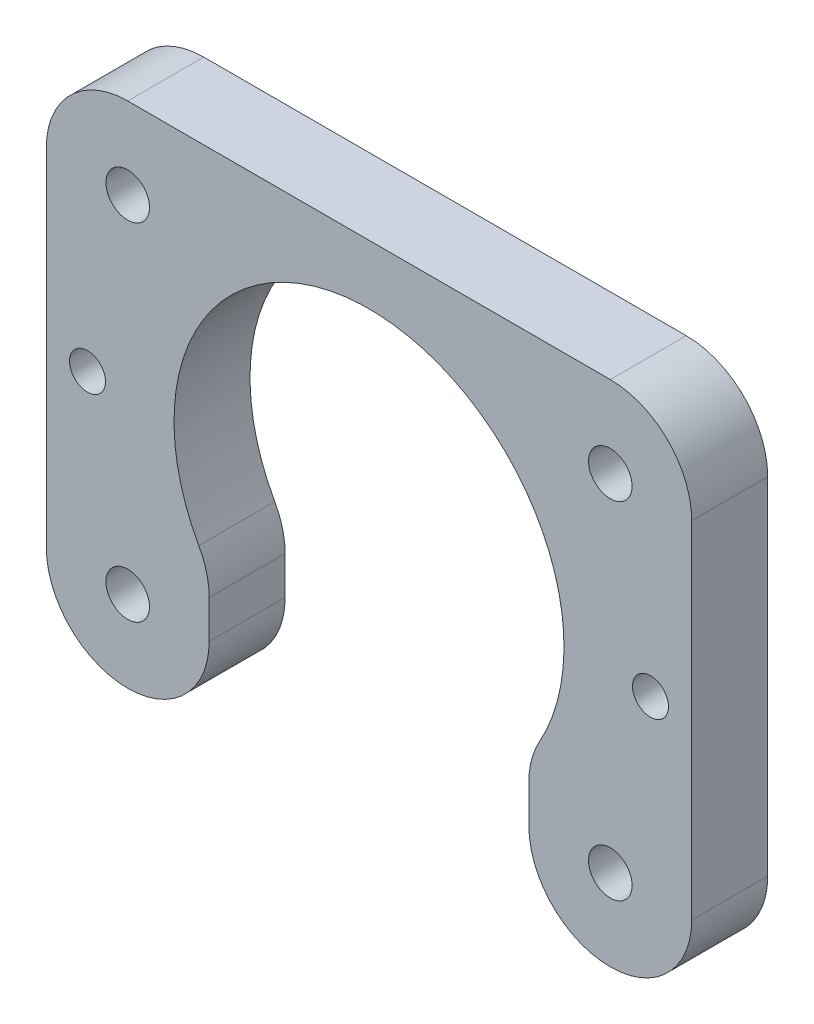
ISO-10303-21;
HEADER;
FILE_DESCRIPTION(('STEP AP214'),'2;1');
FILE_NAME('part.step','',(''),(''),'','','');
FILE_SCHEMA(('AUTOMOTIVE_DESIGN { 1 0 10303 214 1 1 1 1 }'));
ENDSEC;
DATA;
#1=APPLICATION_CONTEXT('core data for automotive mechanical design processes');
#2=APPLICATION_PROTOCOL_DEFINITION('international standard','automotive_design',2000,#1);
#3=PRODUCT_CONTEXT('',#1,'mechanical');
#4=PRODUCT('Part','Part','',(#3));
#5=PRODUCT_RELATED_PRODUCT_CATEGORY('part','',(#4));
#6=PRODUCT_DEFINITION_FORMATION('','',#4);
#7=PRODUCT_DEFINITION_CONTEXT('part definition',#1,'design');
#8=PRODUCT_DEFINITION('design','',#6,#7);
#9=PRODUCT_DEFINITION_SHAPE('','',#8);
#10=(LENGTH_UNIT() NAMED_UNIT(*) SI_UNIT(.MILLI.,.METRE.));
#11=(NAMED_UNIT(*) PLANE_ANGLE_UNIT() SI_UNIT($,.RADIAN.));
#12=(NAMED_UNIT(*) SI_UNIT($,.STERADIAN.) SOLID_ANGLE_UNIT());
#13=UNCERTAINTY_MEASURE_WITH_UNIT(LENGTH_MEASURE(1.E-05),#10,'distance_accuracy_value','');
#14=(GEOMETRIC_REPRESENTATION_CONTEXT(3) GLOBAL_UNCERTAINTY_ASSIGNED_CONTEXT((#13)) GLOBAL_UNIT_ASSIGNED_CONTEXT((#10,
#11,#12)) REPRESENTATION_CONTEXT('',''));
#15=CARTESIAN_POINT('',(0.,0.,0.));
#16=DIRECTION('',(0.,0.,1.));
#17=DIRECTION('',(1.,0.,0.));
#18=AXIS2_PLACEMENT_3D('',#15,#16,#17);
#19=CARTESIAN_POINT('',(-0.0799999999999945,20.,6.));
#20=DIRECTION('',(1.,0.,0.));
#21=DIRECTION('',(0.,0.,-1.));
#22=AXIS2_PLACEMENT_3D('',#19,#20,#21);
#23=PLANE('',#22);
#24=DIRECTION('',(0.,-1.,0.));
#25=VECTOR('',#24,1.);
#26=CARTESIAN_POINT('',(-0.0799999999999945,20.,0.));
#27=LINE('',#26,#25);
#28=CARTESIAN_POINT('',(-0.079999999999995,13.65,0.));
#29=VERTEX_POINT('',#28);
#30=CARTESIAN_POINT('',(-0.0799999999999945,-13.65,0.));
#31=VERTEX_POINT('',#30);
#32=EDGE_CURVE('E140',#29,#31,#27,.T.);
#33=ORIENTED_EDGE('',*,*,#32,.T.);
#34=DIRECTION('',(0.,0.,-1.));
#35=VECTOR('',#34,1.);
#36=CARTESIAN_POINT('',(-0.0799999999999945,-13.65,6.));
#37=LINE('',#36,#35);
#38=CARTESIAN_POINT('',(-0.0799999999999945,-13.65,6.));
#39=VERTEX_POINT('',#38);
#40=EDGE_CURVE('E134',#31,#39,#37,.F.);
#41=ORIENTED_EDGE('',*,*,#40,.T.);
#42=DIRECTION('',(0.,-1.,0.));
#43=VECTOR('',#42,1.);
#44=CARTESIAN_POINT('',(-0.0799999999999945,20.,6.));
#45=LINE('',#44,#43);
#46=CARTESIAN_POINT('',(-0.0799999999999945,13.65,6.));
#47=VERTEX_POINT('',#46);
#48=EDGE_CURVE('E136',#47,#39,#45,.T.);
#49=ORIENTED_EDGE('',*,*,#48,.F.);
#50=DIRECTION('',(0.,0.,-1.));
#51=VECTOR('',#50,1.);
#52=CARTESIAN_POINT('',(-0.0799999999999945,13.65,6.));
#53=LINE('',#52,#51);
#54=EDGE_CURVE('E145',#47,#29,#53,.T.);
#55=ORIENTED_EDGE('',*,*,#54,.T.);
#56=EDGE_LOOP('',(#33,#41,#49,#55));
#57=FACE_BOUND('',#56,.T.);
#58=ADVANCED_FACE('F35',(#57),#23,.F.);
#59=CARTESIAN_POINT('',(50.88,20.,6.));
#60=DIRECTION('',(-1.,0.,0.));
#61=DIRECTION('',(0.,0.,1.));
#62=AXIS2_PLACEMENT_3D('',#59,#60,#61);
#63=PLANE('',#62);
#64=DIRECTION('',(0.,1.,0.));
#65=VECTOR('',#64,1.);
#66=CARTESIAN_POINT('',(50.88,20.,6.));
#67=LINE('',#66,#65);
#68=CARTESIAN_POINT('',(50.88,-13.65,6.));
#69=VERTEX_POINT('',#68);
#70=CARTESIAN_POINT('',(50.88,13.65,6.));
#71=VERTEX_POINT('',#70);
#72=EDGE_CURVE('E152',#69,#71,#67,.T.);
#73=ORIENTED_EDGE('',*,*,#72,.F.);
#74=DIRECTION('',(0.,0.,1.));
#75=VECTOR('',#74,1.);
#76=CARTESIAN_POINT('',(50.88,-13.65,6.));
#77=LINE('',#76,#75);
#78=CARTESIAN_POINT('',(50.88,-13.65,0.));
#79=VERTEX_POINT('',#78);
#80=EDGE_CURVE('E284',#69,#79,#77,.F.);
#81=ORIENTED_EDGE('',*,*,#80,.T.);
#82=DIRECTION('',(0.,1.,0.));
#83=VECTOR('',#82,1.);
#84=CARTESIAN_POINT('',(50.88,20.,0.));
#85=LINE('',#84,#83);
#86=CARTESIAN_POINT('',(50.88,13.65,0.));
#87=VERTEX_POINT('',#86);
#88=EDGE_CURVE('E258',#79,#87,#85,.T.);
#89=ORIENTED_EDGE('',*,*,#88,.T.);
#90=DIRECTION('',(0.,0.,1.));
#91=VECTOR('',#90,1.);
#92=CARTESIAN_POINT('',(50.88,13.65,6.));
#93=LINE('',#92,#91);
#94=EDGE_CURVE('E144',#87,#71,#93,.T.);
#95=ORIENTED_EDGE('',*,*,#94,.T.);
#96=EDGE_LOOP('',(#73,#81,#89,#95));
#97=FACE_BOUND('',#96,.T.);
#98=ADVANCED_FACE('F321',(#97),#63,.F.);
#99=CARTESIAN_POINT('',(50.8,20.08,6.));
#100=DIRECTION('',(0.,-1.,0.));
#101=DIRECTION('',(0.,0.,-1.));
#102=AXIS2_PLACEMENT_3D('',#99,#100,#101);
#103=PLANE('',#102);
#104=DIRECTION('',(-1.,0.,0.));
#105=VECTOR('',#104,1.);
#106=CARTESIAN_POINT('',(50.8,20.08,6.));
#107=LINE('',#106,#105);
#108=CARTESIAN_POINT('',(44.45,20.08,6.));
#109=VERTEX_POINT('',#108);
#110=CARTESIAN_POINT('',(6.35000000000001,20.08,6.));
#111=VERTEX_POINT('',#110);
#112=EDGE_CURVE('E189',#109,#111,#107,.T.);
#113=ORIENTED_EDGE('',*,*,#112,.F.);
#114=DIRECTION('',(0.,0.,-1.));
#115=VECTOR('',#114,1.);
#116=CARTESIAN_POINT('',(44.45,20.08,6.));
#117=LINE('',#116,#115);
#118=CARTESIAN_POINT('',(44.45,20.08,0.));
#119=VERTEX_POINT('',#118);
#120=EDGE_CURVE('E12',#109,#119,#117,.T.);
#121=ORIENTED_EDGE('',*,*,#120,.T.);
#122=DIRECTION('',(-1.,0.,0.));
#123=VECTOR('',#122,1.);
#124=CARTESIAN_POINT('',(50.8,20.08,0.));
#125=LINE('',#124,#123);
#126=CARTESIAN_POINT('',(6.35000000000001,20.08,0.));
#127=VERTEX_POINT('',#126);
#128=EDGE_CURVE('E153',#119,#127,#125,.T.);
#129=ORIENTED_EDGE('',*,*,#128,.T.);
#130=DIRECTION('',(0.,0.,-1.));
#131=VECTOR('',#130,1.);
#132=CARTESIAN_POINT('',(6.35000000000001,20.08,6.));
#133=LINE('',#132,#131);
#134=EDGE_CURVE('E44',#127,#111,#133,.F.);
#135=ORIENTED_EDGE('',*,*,#134,.T.);
#136=EDGE_LOOP('',(#113,#121,#129,#135));
#137=FACE_BOUND('',#136,.T.);
#138=ADVANCED_FACE('F289',(#137),#103,.F.);
#139=CARTESIAN_POINT('',(0.,-20.,6.));
#140=DIRECTION('',(0.,0.,1.));
#141=DIRECTION('',(1.,0.,0.));
#142=AXIS2_PLACEMENT_3D('',#139,#140,#141);
#143=PLANE('',#142);
#144=CARTESIAN_POINT('',(3.17500000000001,0.,6.));
#145=DIRECTION('',(0.,0.,1.));
#146=DIRECTION('',(1.,0.,0.));
#147=AXIS2_PLACEMENT_3D('',#144,#145,#146);
#148=CIRCLE('',#147,1.42);
#149=CARTESIAN_POINT('',(4.59500000000001,0.,6.));
#150=VERTEX_POINT('',#149);
#151=EDGE_CURVE('E199',#150,#150,#148,.T.);
#152=ORIENTED_EDGE('',*,*,#151,.F.);
#153=EDGE_LOOP('',(#152));
#154=FACE_BOUND('',#153,.T.);
#155=CARTESIAN_POINT('',(47.625,0.,6.));
#156=DIRECTION('',(0.,0.,1.));
#157=DIRECTION('',(1.,0.,0.));
#158=AXIS2_PLACEMENT_3D('',#155,#156,#157);
#159=CIRCLE('',#158,1.42);
#160=CARTESIAN_POINT('',(49.045,0.,6.));
#161=VERTEX_POINT('',#160);
#162=EDGE_CURVE('E198',#161,#161,#159,.T.);
#163=ORIENTED_EDGE('',*,*,#162,.F.);
#164=EDGE_LOOP('',(#163));
#165=FACE_BOUND('',#164,.T.);
#166=CARTESIAN_POINT('',(25.4,0.,6.));
#167=DIRECTION('',(0.,0.,1.));
#168=DIRECTION('',(1.,0.,0.));
#169=AXIS2_PLACEMENT_3D('',#166,#167,#168);
#170=CIRCLE('',#169,15.395);
#171=CARTESIAN_POINT('',(38.837560137457,-7.51252304836568,6.));
#172=VERTEX_POINT('',#171);
#173=CARTESIAN_POINT('',(11.962439862543,-7.51252304836568,6.));
#174=VERTEX_POINT('',#173);
#175=EDGE_CURVE('E174',#172,#174,#170,.T.);
#176=ORIENTED_EDGE('',*,*,#175,.F.);
#177=CARTESIAN_POINT('',(44.45,-10.6502640812329,6.));
#178=DIRECTION('',(0.,0.,1.));
#179=DIRECTION('',(1.,0.,0.));
#180=AXIS2_PLACEMENT_3D('',#177,#178,#179);
#181=CIRCLE('',#180,6.43);
#182=CARTESIAN_POINT('',(38.02,-10.6502640812329,6.));
#183=VERTEX_POINT('',#182);
#184=EDGE_CURVE('E176',#172,#183,#181,.T.);
#185=ORIENTED_EDGE('',*,*,#184,.T.);
#186=DIRECTION('',(0.,1.,0.));
#187=VECTOR('',#186,1.);
#188=CARTESIAN_POINT('',(38.02,-20.,6.));
#189=LINE('',#188,#187);
#190=CARTESIAN_POINT('',(38.02,-13.65,6.));
#191=VERTEX_POINT('',#190);
#192=EDGE_CURVE('E173',#191,#183,#189,.T.);
#193=ORIENTED_EDGE('',*,*,#192,.F.);
#194=CARTESIAN_POINT('',(44.45,-13.65,6.));
#195=DIRECTION('',(0.,0.,1.));
#196=DIRECTION('',(1.,0.,0.));
#197=AXIS2_PLACEMENT_3D('',#194,#195,#196);
#198=CIRCLE('',#197,6.43);
#199=CARTESIAN_POINT('',(44.45,-20.08,6.));
#200=VERTEX_POINT('',#199);
#201=EDGE_CURVE('E160',#191,#200,#198,.T.);
#202=ORIENTED_EDGE('',*,*,#201,.T.);
#203=CARTESIAN_POINT('',(44.45,-13.65,6.));
#204=DIRECTION('',(0.,0.,1.));
#205=DIRECTION('',(1.,0.,0.));
#206=AXIS2_PLACEMENT_3D('',#203,#204,#205);
#207=CIRCLE('',#206,6.43);
#208=EDGE_CURVE('E164',#200,#69,#207,.T.);
#209=ORIENTED_EDGE('',*,*,#208,.T.);
#210=ORIENTED_EDGE('',*,*,#72,.T.);
#211=CARTESIAN_POINT('',(44.45,13.65,6.));
#212=DIRECTION('',(0.,0.,1.));
#213=DIRECTION('',(1.,0.,0.));
#214=AXIS2_PLACEMENT_3D('',#211,#212,#213);
#215=CIRCLE('',#214,6.43);
#216=EDGE_CURVE('E186',#71,#109,#215,.T.);
#217=ORIENTED_EDGE('',*,*,#216,.T.);
#218=ORIENTED_EDGE('',*,*,#112,.T.);
#219=CARTESIAN_POINT('',(6.35,13.65,6.));
#220=DIRECTION('',(0.,0.,1.));
#221=DIRECTION('',(1.,0.,0.));
#222=AXIS2_PLACEMENT_3D('',#219,#220,#221);
#223=CIRCLE('',#222,6.43);
#224=EDGE_CURVE('E128',#111,#47,#223,.T.);
#225=ORIENTED_EDGE('',*,*,#224,.T.);
#226=ORIENTED_EDGE('',*,*,#48,.T.);
#227=CARTESIAN_POINT('',(6.35,-13.65,6.));
#228=DIRECTION('',(0.,0.,1.));
#229=DIRECTION('',(1.,0.,0.));
#230=AXIS2_PLACEMENT_3D('',#227,#228,#229);
#231=CIRCLE('',#230,6.43);
#232=CARTESIAN_POINT('',(6.35000000000001,-20.08,6.));
#233=VERTEX_POINT('',#232);
#234=EDGE_CURVE('E150',#39,#233,#231,.T.);
#235=ORIENTED_EDGE('',*,*,#234,.T.);
#236=CARTESIAN_POINT('',(6.35000000000001,-13.65,6.));
#237=DIRECTION('',(0.,0.,1.));
#238=DIRECTION('',(1.,0.,0.));
#239=AXIS2_PLACEMENT_3D('',#236,#237,#238);
#240=CIRCLE('',#239,6.43);
#241=CARTESIAN_POINT('',(12.78,-13.65,6.));
#242=VERTEX_POINT('',#241);
#243=EDGE_CURVE('E159',#233,#242,#240,.T.);
#244=ORIENTED_EDGE('',*,*,#243,.T.);
#245=DIRECTION('',(0.,-1.,0.));
#246=VECTOR('',#245,1.);
#247=CARTESIAN_POINT('',(12.78,-20.,6.));
#248=LINE('',#247,#246);
#249=CARTESIAN_POINT('',(12.78,-10.6502640812329,6.));
#250=VERTEX_POINT('',#249);
#251=EDGE_CURVE('E170',#250,#242,#248,.T.);
#252=ORIENTED_EDGE('',*,*,#251,.F.);
#253=CARTESIAN_POINT('',(6.35000000000001,-10.6502640812329,6.));
#254=DIRECTION('',(0.,0.,1.));
#255=DIRECTION('',(1.,0.,0.));
#256=AXIS2_PLACEMENT_3D('',#253,#254,#255);
#257=CIRCLE('',#256,6.43);
#258=EDGE_CURVE('E162',#250,#174,#257,.T.);
#259=ORIENTED_EDGE('',*,*,#258,.T.);
#260=EDGE_LOOP('',(#176,#185,#193,#202,#209,#210,#217,#218,#225,#226,#235,#244,#252,#259));
#261=FACE_BOUND('',#260,.T.);
#262=CARTESIAN_POINT('',(6.34999999999999,13.65,6.));
#263=DIRECTION('',(0.,0.,1.));
#264=DIRECTION('',(1.,0.,0.));
#265=AXIS2_PLACEMENT_3D('',#262,#263,#264);
#266=CIRCLE('',#265,1.72);
#267=CARTESIAN_POINT('',(8.06999999999999,13.65,6.));
#268=VERTEX_POINT('',#267);
#269=EDGE_CURVE('E38',#268,#268,#266,.T.);
#270=ORIENTED_EDGE('',*,*,#269,.F.);
#271=EDGE_LOOP('',(#270));
#272=FACE_BOUND('',#271,.T.);
#273=CARTESIAN_POINT('',(6.34999999999999,-13.65,6.));
#274=DIRECTION('',(0.,0.,1.));
#275=DIRECTION('',(1.,0.,0.));
#276=AXIS2_PLACEMENT_3D('',#273,#274,#275);
#277=CIRCLE('',#276,1.72);
#278=CARTESIAN_POINT('',(8.06999999999999,-13.65,6.));
#279=VERTEX_POINT('',#278);
#280=EDGE_CURVE('E211',#279,#279,#277,.T.);
#281=ORIENTED_EDGE('',*,*,#280,.F.);
#282=EDGE_LOOP('',(#281));
#283=FACE_BOUND('',#282,.T.);
#284=CARTESIAN_POINT('',(44.45,-13.65,6.));
#285=DIRECTION('',(0.,0.,1.));
#286=DIRECTION('',(1.,0.,0.));
#287=AXIS2_PLACEMENT_3D('',#284,#285,#286);
#288=CIRCLE('',#287,1.72);
#289=CARTESIAN_POINT('',(46.17,-13.65,6.));
#290=VERTEX_POINT('',#289);
#291=EDGE_CURVE('E210',#290,#290,#288,.T.);
#292=ORIENTED_EDGE('',*,*,#291,.F.);
#293=EDGE_LOOP('',(#292));
#294=FACE_BOUND('',#293,.T.);
#295=CARTESIAN_POINT('',(44.45,13.65,6.));
#296=DIRECTION('',(0.,0.,1.));
#297=DIRECTION('',(1.,0.,0.));
#298=AXIS2_PLACEMENT_3D('',#295,#296,#297);
#299=CIRCLE('',#298,1.72);
#300=CARTESIAN_POINT('',(46.17,13.65,6.));
#301=VERTEX_POINT('',#300);
#302=EDGE_CURVE('E218',#301,#301,#299,.T.);
#303=ORIENTED_EDGE('',*,*,#302,.F.);
#304=EDGE_LOOP('',(#303));
#305=FACE_BOUND('',#304,.T.);
#306=ADVANCED_FACE('F148',(#154,#165,#261,#272,#283,#294,#305),#143,.T.);
#307=CARTESIAN_POINT('',(0.,-20.,0.));
#308=DIRECTION('',(0.,0.,1.));
#309=DIRECTION('',(1.,0.,0.));
#310=AXIS2_PLACEMENT_3D('',#307,#308,#309);
#311=PLANE('',#310);
#312=CARTESIAN_POINT('',(3.17500000000001,0.,0.));
#313=DIRECTION('',(0.,0.,1.));
#314=DIRECTION('',(1.,0.,0.));
#315=AXIS2_PLACEMENT_3D('',#312,#313,#314);
#316=CIRCLE('',#315,1.42);
#317=CARTESIAN_POINT('',(4.59500000000001,0.,0.));
#318=VERTEX_POINT('',#317);
#319=EDGE_CURVE('E195',#318,#318,#316,.T.);
#320=ORIENTED_EDGE('',*,*,#319,.T.);
#321=EDGE_LOOP('',(#320));
#322=FACE_BOUND('',#321,.T.);
#323=CARTESIAN_POINT('',(47.625,0.,0.));
#324=DIRECTION('',(0.,0.,1.));
#325=DIRECTION('',(1.,0.,0.));
#326=AXIS2_PLACEMENT_3D('',#323,#324,#325);
#327=CIRCLE('',#326,1.42);
#328=CARTESIAN_POINT('',(49.045,0.,0.));
#329=VERTEX_POINT('',#328);
#330=EDGE_CURVE('E202',#329,#329,#327,.T.);
#331=ORIENTED_EDGE('',*,*,#330,.T.);
#332=EDGE_LOOP('',(#331));
#333=FACE_BOUND('',#332,.T.);
#334=CARTESIAN_POINT('',(6.34999999999999,13.65,0.));
#335=DIRECTION('',(0.,0.,1.));
#336=DIRECTION('',(1.,0.,0.));
#337=AXIS2_PLACEMENT_3D('',#334,#335,#336);
#338=CIRCLE('',#337,1.72);
#339=CARTESIAN_POINT('',(8.06999999999999,13.65,0.));
#340=VERTEX_POINT('',#339);
#341=EDGE_CURVE('E214',#340,#340,#338,.T.);
#342=ORIENTED_EDGE('',*,*,#341,.T.);
#343=EDGE_LOOP('',(#342));
#344=FACE_BOUND('',#343,.T.);
#345=CARTESIAN_POINT('',(6.34999999999999,-13.65,0.));
#346=DIRECTION('',(0.,0.,1.));
#347=DIRECTION('',(1.,0.,0.));
#348=AXIS2_PLACEMENT_3D('',#345,#346,#347);
#349=CIRCLE('',#348,1.72);
#350=CARTESIAN_POINT('',(8.06999999999999,-13.65,0.));
#351=VERTEX_POINT('',#350);
#352=EDGE_CURVE('E207',#351,#351,#349,.T.);
#353=ORIENTED_EDGE('',*,*,#352,.T.);
#354=EDGE_LOOP('',(#353));
#355=FACE_BOUND('',#354,.T.);
#356=CARTESIAN_POINT('',(44.45,-13.65,0.));
#357=DIRECTION('',(0.,0.,1.));
#358=DIRECTION('',(1.,0.,0.));
#359=AXIS2_PLACEMENT_3D('',#356,#357,#358);
#360=CIRCLE('',#359,1.72);
#361=CARTESIAN_POINT('',(46.17,-13.65,0.));
#362=VERTEX_POINT('',#361);
#363=EDGE_CURVE('E215',#362,#362,#360,.T.);
#364=ORIENTED_EDGE('',*,*,#363,.T.);
#365=EDGE_LOOP('',(#364));
#366=FACE_BOUND('',#365,.T.);
#367=CARTESIAN_POINT('',(44.45,13.65,0.));
#368=DIRECTION('',(0.,0.,1.));
#369=DIRECTION('',(1.,0.,0.));
#370=AXIS2_PLACEMENT_3D('',#367,#368,#369);
#371=CIRCLE('',#370,1.72);
#372=CARTESIAN_POINT('',(46.17,13.65,0.));
#373=VERTEX_POINT('',#372);
#374=EDGE_CURVE('E221',#373,#373,#371,.T.);
#375=ORIENTED_EDGE('',*,*,#374,.T.);
#376=EDGE_LOOP('',(#375));
#377=FACE_BOUND('',#376,.T.);
#378=DIRECTION('',(0.,1.,0.));
#379=VECTOR('',#378,1.);
#380=CARTESIAN_POINT('',(38.02,-20.,0.));
#381=LINE('',#380,#379);
#382=CARTESIAN_POINT('',(38.02,-13.65,0.));
#383=VERTEX_POINT('',#382);
#384=CARTESIAN_POINT('',(38.02,-10.6502640812329,0.));
#385=VERTEX_POINT('',#384);
#386=EDGE_CURVE('E229',#383,#385,#381,.T.);
#387=ORIENTED_EDGE('',*,*,#386,.T.);
#388=CARTESIAN_POINT('',(44.45,-10.6502640812329,0.));
#389=DIRECTION('',(0.,0.,1.));
#390=DIRECTION('',(1.,0.,0.));
#391=AXIS2_PLACEMENT_3D('',#388,#389,#390);
#392=CIRCLE('',#391,6.43);
#393=CARTESIAN_POINT('',(38.837560137457,-7.51252304836569,0.));
#394=VERTEX_POINT('',#393);
#395=EDGE_CURVE('E242',#385,#394,#392,.F.);
#396=ORIENTED_EDGE('',*,*,#395,.T.);
#397=CARTESIAN_POINT('',(25.4,0.,0.));
#398=DIRECTION('',(0.,0.,1.));
#399=DIRECTION('',(1.,0.,0.));
#400=AXIS2_PLACEMENT_3D('',#397,#398,#399);
#401=CIRCLE('',#400,15.395);
#402=CARTESIAN_POINT('',(11.962439862543,-7.51252304836568,0.));
#403=VERTEX_POINT('',#402);
#404=EDGE_CURVE('E183',#394,#403,#401,.T.);
#405=ORIENTED_EDGE('',*,*,#404,.T.);
#406=CARTESIAN_POINT('',(6.35000000000001,-10.6502640812329,0.));
#407=DIRECTION('',(0.,0.,1.));
#408=DIRECTION('',(1.,0.,0.));
#409=AXIS2_PLACEMENT_3D('',#406,#407,#408);
#410=CIRCLE('',#409,6.43);
#411=CARTESIAN_POINT('',(12.78,-10.6502640812329,0.));
#412=VERTEX_POINT('',#411);
#413=EDGE_CURVE('E245',#403,#412,#410,.F.);
#414=ORIENTED_EDGE('',*,*,#413,.T.);
#415=DIRECTION('',(0.,-1.,0.));
#416=VECTOR('',#415,1.);
#417=CARTESIAN_POINT('',(12.78,-20.,0.));
#418=LINE('',#417,#416);
#419=CARTESIAN_POINT('',(12.78,-13.65,0.));
#420=VERTEX_POINT('',#419);
#421=EDGE_CURVE('E233',#412,#420,#418,.T.);
#422=ORIENTED_EDGE('',*,*,#421,.T.);
#423=CARTESIAN_POINT('',(6.35000000000001,-13.65,0.));
#424=DIRECTION('',(0.,0.,1.));
#425=DIRECTION('',(1.,0.,0.));
#426=AXIS2_PLACEMENT_3D('',#423,#424,#425);
#427=CIRCLE('',#426,6.43);
#428=CARTESIAN_POINT('',(6.35000000000001,-20.08,0.));
#429=VERTEX_POINT('',#428);
#430=EDGE_CURVE('E167',#420,#429,#427,.F.);
#431=ORIENTED_EDGE('',*,*,#430,.T.);
#432=CARTESIAN_POINT('',(6.35,-13.65,0.));
#433=DIRECTION('',(0.,0.,1.));
#434=DIRECTION('',(1.,0.,0.));
#435=AXIS2_PLACEMENT_3D('',#432,#433,#434);
#436=CIRCLE('',#435,6.43);
#437=EDGE_CURVE('E250',#429,#31,#436,.F.);
#438=ORIENTED_EDGE('',*,*,#437,.T.);
#439=ORIENTED_EDGE('',*,*,#32,.F.);
#440=CARTESIAN_POINT('',(6.35,13.65,0.));
#441=DIRECTION('',(0.,0.,1.));
#442=DIRECTION('',(1.,0.,0.));
#443=AXIS2_PLACEMENT_3D('',#440,#441,#442);
#444=CIRCLE('',#443,6.43);
#445=EDGE_CURVE('E181',#29,#127,#444,.F.);
#446=ORIENTED_EDGE('',*,*,#445,.T.);
#447=ORIENTED_EDGE('',*,*,#128,.F.);
#448=CARTESIAN_POINT('',(44.45,13.65,0.));
#449=DIRECTION('',(0.,0.,1.));
#450=DIRECTION('',(1.,0.,0.));
#451=AXIS2_PLACEMENT_3D('',#448,#449,#450);
#452=CIRCLE('',#451,6.43);
#453=EDGE_CURVE('E53',#119,#87,#452,.F.);
#454=ORIENTED_EDGE('',*,*,#453,.T.);
#455=ORIENTED_EDGE('',*,*,#88,.F.);
#456=CARTESIAN_POINT('',(44.45,-13.65,0.));
#457=DIRECTION('',(0.,0.,1.));
#458=DIRECTION('',(1.,0.,0.));
#459=AXIS2_PLACEMENT_3D('',#456,#457,#458);
#460=CIRCLE('',#459,6.43);
#461=CARTESIAN_POINT('',(44.45,-20.08,0.));
#462=VERTEX_POINT('',#461);
#463=EDGE_CURVE('E253',#79,#462,#460,.F.);
#464=ORIENTED_EDGE('',*,*,#463,.T.);
#465=CARTESIAN_POINT('',(44.45,-13.65,0.));
#466=DIRECTION('',(0.,0.,1.));
#467=DIRECTION('',(1.,0.,0.));
#468=AXIS2_PLACEMENT_3D('',#465,#466,#467);
#469=CIRCLE('',#468,6.43);
#470=EDGE_CURVE('E240',#462,#383,#469,.F.);
#471=ORIENTED_EDGE('',*,*,#470,.T.);
#472=EDGE_LOOP('',(#387,#396,#405,#414,#422,#431,#438,#439,#446,#447,#454,#455,#464,#471));
#473=FACE_BOUND('',#472,.T.);
#474=ADVANCED_FACE('F266',(#322,#333,#344,#355,#366,#377,#473),#311,.F.);
#475=CARTESIAN_POINT('',(44.45,13.65,0.));
#476=DIRECTION('',(0.,0.,1.));
#477=DIRECTION('',(1.,0.,0.));
#478=AXIS2_PLACEMENT_3D('',#475,#476,#477);
#479=CYLINDRICAL_SURFACE('',#478,1.72);
#480=ORIENTED_EDGE('',*,*,#374,.F.);
#481=EDGE_LOOP('',(#480));
#482=FACE_BOUND('',#481,.T.);
#483=ORIENTED_EDGE('',*,*,#302,.T.);
#484=EDGE_LOOP('',(#483));
#485=FACE_BOUND('',#484,.T.);
#486=ADVANCED_FACE('F367',(#482,#485),#479,.F.);
#487=CARTESIAN_POINT('',(44.45,-13.65,0.));
#488=DIRECTION('',(0.,0.,1.));
#489=DIRECTION('',(1.,0.,0.));
#490=AXIS2_PLACEMENT_3D('',#487,#488,#489);
#491=CYLINDRICAL_SURFACE('',#490,1.72);
#492=ORIENTED_EDGE('',*,*,#363,.F.);
#493=EDGE_LOOP('',(#492));
#494=FACE_BOUND('',#493,.T.);
#495=ORIENTED_EDGE('',*,*,#291,.T.);
#496=EDGE_LOOP('',(#495));
#497=FACE_BOUND('',#496,.T.);
#498=ADVANCED_FACE('F391',(#494,#497),#491,.F.);
#499=CARTESIAN_POINT('',(6.34999999999999,-13.65,0.));
#500=DIRECTION('',(0.,0.,1.));
#501=DIRECTION('',(1.,0.,0.));
#502=AXIS2_PLACEMENT_3D('',#499,#500,#501);
#503=CYLINDRICAL_SURFACE('',#502,1.72);
#504=ORIENTED_EDGE('',*,*,#352,.F.);
#505=EDGE_LOOP('',(#504));
#506=FACE_BOUND('',#505,.T.);
#507=ORIENTED_EDGE('',*,*,#280,.T.);
#508=EDGE_LOOP('',(#507));
#509=FACE_BOUND('',#508,.T.);
#510=ADVANCED_FACE('F388',(#506,#509),#503,.F.);
#511=CARTESIAN_POINT('',(6.34999999999999,13.65,0.));
#512=DIRECTION('',(0.,0.,1.));
#513=DIRECTION('',(1.,0.,0.));
#514=AXIS2_PLACEMENT_3D('',#511,#512,#513);
#515=CYLINDRICAL_SURFACE('',#514,1.72);
#516=ORIENTED_EDGE('',*,*,#341,.F.);
#517=EDGE_LOOP('',(#516));
#518=FACE_BOUND('',#517,.T.);
#519=ORIENTED_EDGE('',*,*,#269,.T.);
#520=EDGE_LOOP('',(#519));
#521=FACE_BOUND('',#520,.T.);
#522=ADVANCED_FACE('F356',(#518,#521),#515,.F.);
#523=CARTESIAN_POINT('',(25.4,0.,0.));
#524=DIRECTION('',(0.,0.,1.));
#525=DIRECTION('',(1.,0.,0.));
#526=AXIS2_PLACEMENT_3D('',#523,#524,#525);
#527=CYLINDRICAL_SURFACE('',#526,15.395);
#528=ORIENTED_EDGE('',*,*,#404,.F.);
#529=DIRECTION('',(0.,0.,1.));
#530=VECTOR('',#529,1.);
#531=CARTESIAN_POINT('',(38.837560137457,-7.51252304836569,0.));
#532=LINE('',#531,#530);
#533=EDGE_CURVE('E303',#394,#172,#532,.T.);
#534=ORIENTED_EDGE('',*,*,#533,.T.);
#535=ORIENTED_EDGE('',*,*,#175,.T.);
#536=DIRECTION('',(0.,0.,1.));
#537=VECTOR('',#536,1.);
#538=CARTESIAN_POINT('',(11.962439862543,-7.51252304836568,0.));
#539=LINE('',#538,#537);
#540=EDGE_CURVE('E244',#174,#403,#539,.F.);
#541=ORIENTED_EDGE('',*,*,#540,.T.);
#542=EDGE_LOOP('',(#528,#534,#535,#541));
#543=FACE_BOUND('',#542,.T.);
#544=ADVANCED_FACE('F311',(#543),#527,.F.);
#545=CARTESIAN_POINT('',(38.02,-20.,0.));
#546=DIRECTION('',(1.,0.,0.));
#547=DIRECTION('',(0.,1.,0.));
#548=AXIS2_PLACEMENT_3D('',#545,#546,#547);
#549=PLANE('',#548);
#550=ORIENTED_EDGE('',*,*,#386,.F.);
#551=DIRECTION('',(0.,0.,1.));
#552=VECTOR('',#551,1.);
#553=CARTESIAN_POINT('',(38.02,-13.65,0.));
#554=LINE('',#553,#552);
#555=EDGE_CURVE('E193',#383,#191,#554,.T.);
#556=ORIENTED_EDGE('',*,*,#555,.T.);
#557=ORIENTED_EDGE('',*,*,#192,.T.);
#558=DIRECTION('',(0.,0.,1.));
#559=VECTOR('',#558,1.);
#560=CARTESIAN_POINT('',(38.02,-10.6502640812329,0.));
#561=LINE('',#560,#559);
#562=EDGE_CURVE('E192',#183,#385,#561,.F.);
#563=ORIENTED_EDGE('',*,*,#562,.T.);
#564=EDGE_LOOP('',(#550,#556,#557,#563));
#565=FACE_BOUND('',#564,.T.);
#566=ADVANCED_FACE('F318',(#565),#549,.F.);
#567=CARTESIAN_POINT('',(12.78,-8.84226356766187,0.));
#568=DIRECTION('',(-1.,0.,0.));
#569=DIRECTION('',(0.,-1.,0.));
#570=AXIS2_PLACEMENT_3D('',#567,#568,#569);
#571=PLANE('',#570);
#572=ORIENTED_EDGE('',*,*,#421,.F.);
#573=DIRECTION('',(0.,0.,1.));
#574=VECTOR('',#573,1.);
#575=CARTESIAN_POINT('',(12.78,-10.6502640812329,0.));
#576=LINE('',#575,#574);
#577=EDGE_CURVE('E295',#412,#250,#576,.T.);
#578=ORIENTED_EDGE('',*,*,#577,.T.);
#579=ORIENTED_EDGE('',*,*,#251,.T.);
#580=DIRECTION('',(0.,0.,1.));
#581=VECTOR('',#580,1.);
#582=CARTESIAN_POINT('',(12.78,-13.65,0.));
#583=LINE('',#582,#581);
#584=EDGE_CURVE('E297',#242,#420,#583,.F.);
#585=ORIENTED_EDGE('',*,*,#584,.T.);
#586=EDGE_LOOP('',(#572,#578,#579,#585));
#587=FACE_BOUND('',#586,.T.);
#588=ADVANCED_FACE('F349',(#587),#571,.F.);
#589=CARTESIAN_POINT('',(44.45,-13.65,6.));
#590=DIRECTION('',(0.,0.,-1.));
#591=DIRECTION('',(-1.,0.,0.));
#592=AXIS2_PLACEMENT_3D('',#589,#590,#591);
#593=CYLINDRICAL_SURFACE('',#592,6.43);
#594=DIRECTION('',(0.,0.,1.));
#595=VECTOR('',#594,1.);
#596=CARTESIAN_POINT('',(44.45,-20.08,0.));
#597=LINE('',#596,#595);
#598=EDGE_CURVE('E179',#462,#200,#597,.T.);
#599=ORIENTED_EDGE('',*,*,#598,.F.);
#600=ORIENTED_EDGE('',*,*,#463,.F.);
#601=ORIENTED_EDGE('',*,*,#80,.F.);
#602=ORIENTED_EDGE('',*,*,#208,.F.);
#603=EDGE_LOOP('',(#599,#600,#601,#602));
#604=FACE_BOUND('',#603,.T.);
#605=ADVANCED_FACE('F272',(#604),#593,.T.);
#606=CARTESIAN_POINT('',(44.45,-13.65,0.));
#607=DIRECTION('',(0.,0.,1.));
#608=DIRECTION('',(1.,0.,0.));
#609=AXIS2_PLACEMENT_3D('',#606,#607,#608);
#610=CYLINDRICAL_SURFACE('',#609,6.43);
#611=ORIENTED_EDGE('',*,*,#470,.F.);
#612=ORIENTED_EDGE('',*,*,#598,.T.);
#613=ORIENTED_EDGE('',*,*,#201,.F.);
#614=ORIENTED_EDGE('',*,*,#555,.F.);
#615=EDGE_LOOP('',(#611,#612,#613,#614));
#616=FACE_BOUND('',#615,.T.);
#617=ADVANCED_FACE('F276',(#616),#610,.T.);
#618=CARTESIAN_POINT('',(44.45,-10.6502640812329,0.));
#619=DIRECTION('',(0.,0.,1.));
#620=DIRECTION('',(1.,0.,0.));
#621=AXIS2_PLACEMENT_3D('',#618,#619,#620);
#622=CYLINDRICAL_SURFACE('',#621,6.43);
#623=ORIENTED_EDGE('',*,*,#395,.F.);
#624=ORIENTED_EDGE('',*,*,#562,.F.);
#625=ORIENTED_EDGE('',*,*,#184,.F.);
#626=ORIENTED_EDGE('',*,*,#533,.F.);
#627=EDGE_LOOP('',(#623,#624,#625,#626));
#628=FACE_BOUND('',#627,.T.);
#629=ADVANCED_FACE('F317',(#628),#622,.T.);
#630=CARTESIAN_POINT('',(6.35000000000001,-10.6502640812329,0.));
#631=DIRECTION('',(0.,0.,1.));
#632=DIRECTION('',(1.,0.,0.));
#633=AXIS2_PLACEMENT_3D('',#630,#631,#632);
#634=CYLINDRICAL_SURFACE('',#633,6.43);
#635=ORIENTED_EDGE('',*,*,#413,.F.);
#636=ORIENTED_EDGE('',*,*,#540,.F.);
#637=ORIENTED_EDGE('',*,*,#258,.F.);
#638=ORIENTED_EDGE('',*,*,#577,.F.);
#639=EDGE_LOOP('',(#635,#636,#637,#638));
#640=FACE_BOUND('',#639,.T.);
#641=ADVANCED_FACE('F315',(#640),#634,.T.);
#642=CARTESIAN_POINT('',(6.35,-13.65,6.));
#643=DIRECTION('',(0.,0.,-1.));
#644=DIRECTION('',(-1.,0.,0.));
#645=AXIS2_PLACEMENT_3D('',#642,#643,#644);
#646=CYLINDRICAL_SURFACE('',#645,6.43);
#647=ORIENTED_EDGE('',*,*,#40,.F.);
#648=ORIENTED_EDGE('',*,*,#437,.F.);
#649=DIRECTION('',(0.,0.,1.));
#650=VECTOR('',#649,1.);
#651=CARTESIAN_POINT('',(6.35000000000001,-20.08,6.));
#652=LINE('',#651,#650);
#653=EDGE_CURVE('E157',#233,#429,#652,.F.);
#654=ORIENTED_EDGE('',*,*,#653,.F.);
#655=ORIENTED_EDGE('',*,*,#234,.F.);
#656=EDGE_LOOP('',(#647,#648,#654,#655));
#657=FACE_BOUND('',#656,.T.);
#658=ADVANCED_FACE('F155',(#657),#646,.T.);
#659=CARTESIAN_POINT('',(6.35000000000001,-13.65,6.));
#660=DIRECTION('',(0.,0.,1.));
#661=DIRECTION('',(1.,0.,0.));
#662=AXIS2_PLACEMENT_3D('',#659,#660,#661);
#663=CYLINDRICAL_SURFACE('',#662,6.43);
#664=ORIENTED_EDGE('',*,*,#430,.F.);
#665=ORIENTED_EDGE('',*,*,#584,.F.);
#666=ORIENTED_EDGE('',*,*,#243,.F.);
#667=ORIENTED_EDGE('',*,*,#653,.T.);
#668=EDGE_LOOP('',(#664,#665,#666,#667));
#669=FACE_BOUND('',#668,.T.);
#670=ADVANCED_FACE('F328',(#669),#663,.T.);
#671=CARTESIAN_POINT('',(44.45,13.65,6.));
#672=DIRECTION('',(0.,0.,-1.));
#673=DIRECTION('',(-1.,0.,0.));
#674=AXIS2_PLACEMENT_3D('',#671,#672,#673);
#675=CYLINDRICAL_SURFACE('',#674,6.43);
#676=ORIENTED_EDGE('',*,*,#216,.F.);
#677=ORIENTED_EDGE('',*,*,#94,.F.);
#678=ORIENTED_EDGE('',*,*,#453,.F.);
#679=ORIENTED_EDGE('',*,*,#120,.F.);
#680=EDGE_LOOP('',(#676,#677,#678,#679));
#681=FACE_BOUND('',#680,.T.);
#682=ADVANCED_FACE('F324',(#681),#675,.T.);
#683=CARTESIAN_POINT('',(6.35,13.65,6.));
#684=DIRECTION('',(0.,0.,-1.));
#685=DIRECTION('',(-1.,0.,0.));
#686=AXIS2_PLACEMENT_3D('',#683,#684,#685);
#687=CYLINDRICAL_SURFACE('',#686,6.43);
#688=ORIENTED_EDGE('',*,*,#224,.F.);
#689=ORIENTED_EDGE('',*,*,#134,.F.);
#690=ORIENTED_EDGE('',*,*,#445,.F.);
#691=ORIENTED_EDGE('',*,*,#54,.F.);
#692=EDGE_LOOP('',(#688,#689,#690,#691));
#693=FACE_BOUND('',#692,.T.);
#694=ADVANCED_FACE('F294',(#693),#687,.T.);
#695=CARTESIAN_POINT('',(47.625,0.,0.));
#696=DIRECTION('',(0.,0.,1.));
#697=DIRECTION('',(1.,0.,0.));
#698=AXIS2_PLACEMENT_3D('',#695,#696,#697);
#699=CYLINDRICAL_SURFACE('',#698,1.42);
#700=ORIENTED_EDGE('',*,*,#330,.F.);
#701=EDGE_LOOP('',(#700));
#702=FACE_BOUND('',#701,.T.);
#703=ORIENTED_EDGE('',*,*,#162,.T.);
#704=EDGE_LOOP('',(#703));
#705=FACE_BOUND('',#704,.T.);
#706=ADVANCED_FACE('F334',(#702,#705),#699,.F.);
#707=CARTESIAN_POINT('',(3.17500000000001,0.,0.));
#708=DIRECTION('',(0.,0.,1.));
#709=DIRECTION('',(1.,0.,0.));
#710=AXIS2_PLACEMENT_3D('',#707,#708,#709);
#711=CYLINDRICAL_SURFACE('',#710,1.42);
#712=ORIENTED_EDGE('',*,*,#319,.F.);
#713=EDGE_LOOP('',(#712));
#714=FACE_BOUND('',#713,.T.);
#715=ORIENTED_EDGE('',*,*,#151,.T.);
#716=EDGE_LOOP('',(#715));
#717=FACE_BOUND('',#716,.T.);
#718=ADVANCED_FACE('F378',(#714,#717),#711,.F.);
#719=CLOSED_SHELL('',(#58,#98,#138,#306,#474,#486,#498,#510,#522,#544,#566,#588,#605,#617,#629,
#641,#658,#670,#682,#694,#706,#718));
#720=MANIFOLD_SOLID_BREP('B2',#719);
#721=ADVANCED_BREP_SHAPE_REPRESENTATION('',(#18,#720),#14);
#722=SHAPE_DEFINITION_REPRESENTATION(#9,#721);
ENDSEC;
END-ISO-10303-21;
